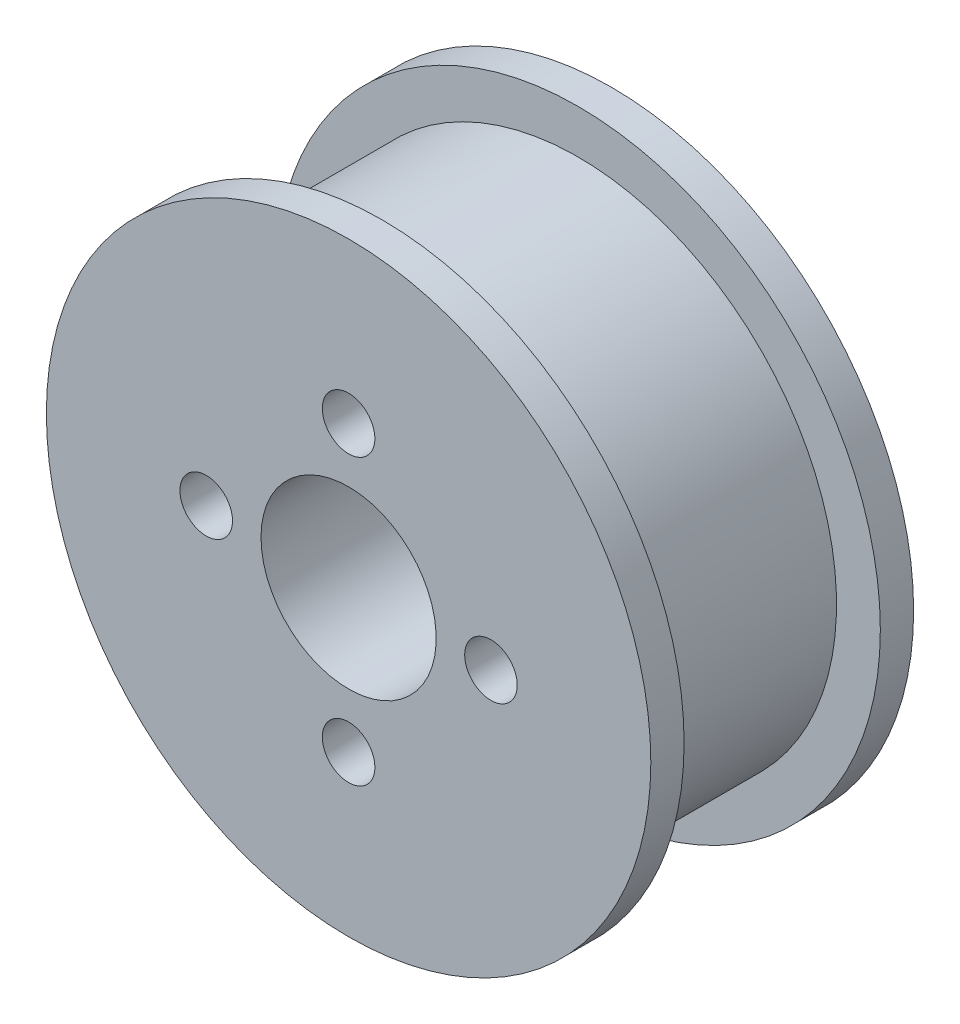
ISO-10303-21;
HEADER;
FILE_DESCRIPTION(('STEP AP214'),'2;1');
FILE_NAME('part.step','',(''),(''),'','','');
FILE_SCHEMA(('AUTOMOTIVE_DESIGN { 1 0 10303 214 1 1 1 1 }'));
ENDSEC;
DATA;
#1=APPLICATION_CONTEXT('core data for automotive mechanical design processes');
#2=APPLICATION_PROTOCOL_DEFINITION('international standard','automotive_design',2000,#1);
#3=PRODUCT_CONTEXT('',#1,'mechanical');
#4=PRODUCT('Part','Part','',(#3));
#5=PRODUCT_RELATED_PRODUCT_CATEGORY('part','',(#4));
#6=PRODUCT_DEFINITION_FORMATION('','',#4);
#7=PRODUCT_DEFINITION_CONTEXT('part definition',#1,'design');
#8=PRODUCT_DEFINITION('design','',#6,#7);
#9=PRODUCT_DEFINITION_SHAPE('','',#8);
#10=(LENGTH_UNIT() NAMED_UNIT(*) SI_UNIT(.MILLI.,.METRE.));
#11=(NAMED_UNIT(*) PLANE_ANGLE_UNIT() SI_UNIT($,.RADIAN.));
#12=(NAMED_UNIT(*) SI_UNIT($,.STERADIAN.) SOLID_ANGLE_UNIT());
#13=UNCERTAINTY_MEASURE_WITH_UNIT(LENGTH_MEASURE(1.E-05),#10,'distance_accuracy_value','');
#14=(GEOMETRIC_REPRESENTATION_CONTEXT(3) GLOBAL_UNCERTAINTY_ASSIGNED_CONTEXT((#13)) GLOBAL_UNIT_ASSIGNED_CONTEXT((#10,
#11,#12)) REPRESENTATION_CONTEXT('',''));
#15=CARTESIAN_POINT('',(0.,0.,0.));
#16=DIRECTION('',(0.,0.,1.));
#17=DIRECTION('',(1.,0.,0.));
#18=AXIS2_PLACEMENT_3D('',#15,#16,#17);
#19=CARTESIAN_POINT('',(0.,0.,1.9));
#20=DIRECTION('',(0.,0.,-1.));
#21=DIRECTION('',(-1.,0.,0.));
#22=AXIS2_PLACEMENT_3D('',#19,#20,#21);
#23=CYLINDRICAL_SURFACE('',#22,17.25);
#24=CARTESIAN_POINT('',(0.,0.,1.9));
#25=DIRECTION('',(0.,0.,1.));
#26=DIRECTION('',(1.,0.,0.));
#27=AXIS2_PLACEMENT_3D('',#24,#25,#26);
#28=CIRCLE('',#27,17.25);
#29=CARTESIAN_POINT('',(-17.25,0.,1.9));
#30=VERTEX_POINT('',#29);
#31=EDGE_CURVE('E44',#30,#30,#28,.T.);
#32=CARTESIAN_POINT('',(0.,0.,0.));
#33=DIRECTION('',(0.,0.,1.));
#34=DIRECTION('',(1.,0.,0.));
#35=AXIS2_PLACEMENT_3D('',#32,#33,#34);
#36=CIRCLE('',#35,17.25);
#37=CARTESIAN_POINT('',(-17.25,0.,0.));
#38=VERTEX_POINT('',#37);
#39=EDGE_CURVE('E40',#38,#38,#36,.T.);
#40=CARTESIAN_POINT('',(-17.25,0.,1.9));
#41=CARTESIAN_POINT('',(-17.25,0.,1.88020833333333));
#42=CARTESIAN_POINT('',(-17.25,0.,1.86041666666667));
#43=CARTESIAN_POINT('',(-17.25,0.,1.82083333333333));
#44=CARTESIAN_POINT('',(-17.25,0.,1.80104166666667));
#45=CARTESIAN_POINT('',(-17.25,0.,1.76145833333333));
#46=CARTESIAN_POINT('',(-17.25,0.,1.74166666666667));
#47=CARTESIAN_POINT('',(-17.25,0.,1.70208333333333));
#48=CARTESIAN_POINT('',(-17.25,0.,1.68229166666667));
#49=CARTESIAN_POINT('',(-17.25,0.,1.64270833333333));
#50=CARTESIAN_POINT('',(-17.25,0.,1.62291666666667));
#51=CARTESIAN_POINT('',(-17.25,0.,1.58333333333333));
#52=CARTESIAN_POINT('',(-17.25,0.,1.56354166666667));
#53=CARTESIAN_POINT('',(-17.25,0.,1.52395833333333));
#54=CARTESIAN_POINT('',(-17.25,0.,1.50416666666667));
#55=CARTESIAN_POINT('',(-17.25,0.,1.46458333333333));
#56=CARTESIAN_POINT('',(-17.25,0.,1.44479166666667));
#57=CARTESIAN_POINT('',(-17.25,0.,1.40520833333333));
#58=CARTESIAN_POINT('',(-17.25,0.,1.38541666666667));
#59=CARTESIAN_POINT('',(-17.25,0.,1.34583333333333));
#60=CARTESIAN_POINT('',(-17.25,0.,1.32604166666667));
#61=CARTESIAN_POINT('',(-17.25,0.,1.28645833333333));
#62=CARTESIAN_POINT('',(-17.25,0.,1.26666666666667));
#63=CARTESIAN_POINT('',(-17.25,0.,1.22708333333333));
#64=CARTESIAN_POINT('',(-17.25,0.,1.20729166666667));
#65=CARTESIAN_POINT('',(-17.25,0.,1.16770833333333));
#66=CARTESIAN_POINT('',(-17.25,0.,1.14791666666667));
#67=CARTESIAN_POINT('',(-17.25,0.,1.10833333333333));
#68=CARTESIAN_POINT('',(-17.25,0.,1.08854166666667));
#69=CARTESIAN_POINT('',(-17.25,0.,1.04895833333333));
#70=CARTESIAN_POINT('',(-17.25,0.,1.02916666666667));
#71=CARTESIAN_POINT('',(-17.25,0.,0.989583333333333));
#72=CARTESIAN_POINT('',(-17.25,0.,0.969791666666666));
#73=CARTESIAN_POINT('',(-17.25,0.,0.930208333333333));
#74=CARTESIAN_POINT('',(-17.25,0.,0.910416666666667));
#75=CARTESIAN_POINT('',(-17.25,0.,0.870833333333333));
#76=CARTESIAN_POINT('',(-17.25,0.,0.851041666666667));
#77=CARTESIAN_POINT('',(-17.25,0.,0.811458333333333));
#78=CARTESIAN_POINT('',(-17.25,0.,0.791666666666667));
#79=CARTESIAN_POINT('',(-17.25,0.,0.752083333333333));
#80=CARTESIAN_POINT('',(-17.25,0.,0.732291666666667));
#81=CARTESIAN_POINT('',(-17.25,0.,0.692708333333333));
#82=CARTESIAN_POINT('',(-17.25,0.,0.672916666666667));
#83=CARTESIAN_POINT('',(-17.25,0.,0.633333333333333));
#84=CARTESIAN_POINT('',(-17.25,0.,0.613541666666667));
#85=CARTESIAN_POINT('',(-17.25,0.,0.573958333333333));
#86=CARTESIAN_POINT('',(-17.25,0.,0.554166666666667));
#87=CARTESIAN_POINT('',(-17.25,0.,0.514583333333334));
#88=CARTESIAN_POINT('',(-17.25,0.,0.494791666666667));
#89=CARTESIAN_POINT('',(-17.25,0.,0.455208333333333));
#90=CARTESIAN_POINT('',(-17.25,0.,0.435416666666667));
#91=CARTESIAN_POINT('',(-17.25,0.,0.395833333333333));
#92=CARTESIAN_POINT('',(-17.25,0.,0.376041666666667));
#93=CARTESIAN_POINT('',(-17.25,0.,0.336458333333333));
#94=CARTESIAN_POINT('',(-17.25,0.,0.316666666666667));
#95=CARTESIAN_POINT('',(-17.25,0.,0.277083333333333));
#96=CARTESIAN_POINT('',(-17.25,0.,0.257291666666667));
#97=CARTESIAN_POINT('',(-17.25,0.,0.217708333333333));
#98=CARTESIAN_POINT('',(-17.25,0.,0.197916666666667));
#99=CARTESIAN_POINT('',(-17.25,0.,0.158333333333333));
#100=CARTESIAN_POINT('',(-17.25,0.,0.138541666666667));
#101=CARTESIAN_POINT('',(-17.25,0.,0.0989583333333333));
#102=CARTESIAN_POINT('',(-17.25,0.,0.0791666666666666));
#103=CARTESIAN_POINT('',(-17.25,0.,0.0395833333333333));
#104=CARTESIAN_POINT('',(-17.25,0.,0.0197916666666666));
#105=CARTESIAN_POINT('',(-17.25,0.,0.));
#106=B_SPLINE_CURVE_WITH_KNOTS('',3,(#40,#41,#42,#43,#44,#45,#46,#47,#48,#49,#50,#51,#52,#53,
#54,#55,#56,#57,#58,#59,#60,#61,#62,#63,#64,#65,#66,#67,#68,#69,#70,#71,#72,#73,#74,#75,#76,#77,
#78,#79,#80,#81,#82,#83,#84,#85,#86,#87,#88,#89,#90,#91,#92,#93,#94,#95,#96,#97,#98,#99,#100,
#101,#102,#103,#104,#105),.UNSPECIFIED.,.F.,.F.,(4,2,2,2,2,2,2,2,2,2,2,2,2,2,2,2,2,2,2,2,2,2,2,
2,2,2,2,2,2,2,2,2,4),(0.,0.0593750000000002,0.11875,0.178125,0.2375,0.296875,0.35625,0.415625,
0.475,0.534375,0.59375,0.653125,0.7125,0.771875,0.83125,0.890625,0.95,1.009375,1.06875,1.128125,
1.1875,1.246875,1.30625,1.365625,1.425,1.484375,1.54375,1.603125,1.6625,1.721875,1.78125,
1.840625,1.9),.UNSPECIFIED.);
#107=EDGE_CURVE('BSEAM37',#30,#38,#106,.T.);
#108=ORIENTED_EDGE('',*,*,#31,.F.);
#109=ORIENTED_EDGE('',*,*,#39,.T.);
#110=ORIENTED_EDGE('',*,*,#107,.T.);
#111=ORIENTED_EDGE('',*,*,#107,.F.);
#112=EDGE_LOOP('',(#108,#110,#109,#111));
#113=FACE_BOUND('',#112,.T.);
#114=ADVANCED_FACE('F37',(#113),#23,.T.);
#115=CARTESIAN_POINT('',(0.,0.,1.9));
#116=DIRECTION('',(0.,0.,1.));
#117=DIRECTION('',(1.,0.,0.));
#118=AXIS2_PLACEMENT_3D('',#115,#116,#117);
#119=PLANE('',#118);
#120=CARTESIAN_POINT('',(0.,8.125,1.9));
#121=DIRECTION('',(0.,0.,-1.));
#122=DIRECTION('',(-1.,0.,0.));
#123=AXIS2_PLACEMENT_3D('',#120,#121,#122);
#124=CIRCLE('',#123,1.5);
#125=CARTESIAN_POINT('',(-1.5,8.125,1.9));
#126=VERTEX_POINT('',#125);
#127=EDGE_CURVE('E63',#126,#126,#124,.T.);
#128=ORIENTED_EDGE('',*,*,#127,.T.);
#129=EDGE_LOOP('',(#128));
#130=FACE_BOUND('',#129,.T.);
#131=CARTESIAN_POINT('',(-8.125,0.,1.9));
#132=DIRECTION('',(0.,0.,-1.));
#133=DIRECTION('',(-1.,0.,0.));
#134=AXIS2_PLACEMENT_3D('',#131,#132,#133);
#135=CIRCLE('',#134,1.5);
#136=CARTESIAN_POINT('',(-9.625,0.,1.9));
#137=VERTEX_POINT('',#136);
#138=EDGE_CURVE('E78',#137,#137,#135,.T.);
#139=ORIENTED_EDGE('',*,*,#138,.T.);
#140=EDGE_LOOP('',(#139));
#141=FACE_BOUND('',#140,.T.);
#142=CARTESIAN_POINT('',(0.,-8.125,1.9));
#143=DIRECTION('',(0.,0.,-1.));
#144=DIRECTION('',(-1.,0.,0.));
#145=AXIS2_PLACEMENT_3D('',#142,#143,#144);
#146=CIRCLE('',#145,1.5);
#147=CARTESIAN_POINT('',(-1.5,-8.125,1.9));
#148=VERTEX_POINT('',#147);
#149=EDGE_CURVE('E72',#148,#148,#146,.T.);
#150=ORIENTED_EDGE('',*,*,#149,.T.);
#151=EDGE_LOOP('',(#150));
#152=FACE_BOUND('',#151,.T.);
#153=CARTESIAN_POINT('',(8.125,0.,1.9));
#154=DIRECTION('',(0.,0.,-1.));
#155=DIRECTION('',(-1.,0.,0.));
#156=AXIS2_PLACEMENT_3D('',#153,#154,#155);
#157=CIRCLE('',#156,1.5);
#158=CARTESIAN_POINT('',(6.625,0.,1.9));
#159=VERTEX_POINT('',#158);
#160=EDGE_CURVE('E66',#159,#159,#157,.T.);
#161=ORIENTED_EDGE('',*,*,#160,.T.);
#162=EDGE_LOOP('',(#161));
#163=FACE_BOUND('',#162,.T.);
#164=CARTESIAN_POINT('',(0.,0.,1.9));
#165=DIRECTION('',(0.,0.,-1.));
#166=DIRECTION('',(-1.,0.,0.));
#167=AXIS2_PLACEMENT_3D('',#164,#165,#166);
#168=CIRCLE('',#167,5.);
#169=CARTESIAN_POINT('',(-5.,0.,1.9));
#170=VERTEX_POINT('',#169);
#171=EDGE_CURVE('E57',#170,#170,#168,.T.);
#172=ORIENTED_EDGE('',*,*,#171,.T.);
#173=EDGE_LOOP('',(#172));
#174=FACE_BOUND('',#173,.T.);
#175=ORIENTED_EDGE('',*,*,#31,.T.);
#176=EDGE_LOOP('',(#175));
#177=FACE_BOUND('',#176,.T.);
#178=ADVANCED_FACE('F90',(#130,#141,#152,#163,#174,#177),#119,.T.);
#179=CARTESIAN_POINT('',(0.,0.,0.));
#180=DIRECTION('',(0.,0.,1.));
#181=DIRECTION('',(1.,0.,0.));
#182=AXIS2_PLACEMENT_3D('',#179,#180,#181);
#183=PLANE('',#182);
#184=CARTESIAN_POINT('',(0.,0.,0.));
#185=DIRECTION('',(0.,0.,-1.));
#186=DIRECTION('',(-1.,0.,0.));
#187=AXIS2_PLACEMENT_3D('',#184,#185,#186);
#188=CIRCLE('',#187,14.75);
#189=CARTESIAN_POINT('',(-14.75,0.,0.));
#190=VERTEX_POINT('',#189);
#191=EDGE_CURVE('E10',#190,#190,#188,.T.);
#192=ORIENTED_EDGE('',*,*,#191,.F.);
#193=EDGE_LOOP('',(#192));
#194=FACE_BOUND('',#193,.T.);
#195=ORIENTED_EDGE('',*,*,#39,.F.);
#196=EDGE_LOOP('',(#195));
#197=FACE_BOUND('',#196,.T.);
#198=ADVANCED_FACE('F138',(#194,#197),#183,.F.);
#199=CARTESIAN_POINT('',(0.,0.,-11.2));
#200=DIRECTION('',(0.,0.,1.));
#201=DIRECTION('',(1.,0.,0.));
#202=AXIS2_PLACEMENT_3D('',#199,#200,#201);
#203=CYLINDRICAL_SURFACE('',#202,14.75);
#204=CARTESIAN_POINT('',(0.,0.,-11.2));
#205=DIRECTION('',(0.,0.,-1.));
#206=DIRECTION('',(-1.,0.,0.));
#207=AXIS2_PLACEMENT_3D('',#204,#205,#206);
#208=CIRCLE('',#207,14.75);
#209=CARTESIAN_POINT('',(-14.75,0.,-11.2));
#210=VERTEX_POINT('',#209);
#211=EDGE_CURVE('E50',#210,#210,#208,.T.);
#212=ORIENTED_EDGE('',*,*,#211,.F.);
#213=EDGE_LOOP('',(#212));
#214=FACE_BOUND('',#213,.T.);
#215=ORIENTED_EDGE('',*,*,#191,.T.);
#216=EDGE_LOOP('',(#215));
#217=FACE_BOUND('',#216,.T.);
#218=ADVANCED_FACE('F118',(#214,#217),#203,.T.);
#219=CARTESIAN_POINT('',(0.,0.,-13.1));
#220=DIRECTION('',(0.,0.,1.));
#221=DIRECTION('',(1.,0.,0.));
#222=AXIS2_PLACEMENT_3D('',#219,#220,#221);
#223=CYLINDRICAL_SURFACE('',#222,17.25);
#224=CARTESIAN_POINT('',(0.,0.,-13.1));
#225=DIRECTION('',(0.,0.,-1.));
#226=DIRECTION('',(-1.,0.,0.));
#227=AXIS2_PLACEMENT_3D('',#224,#225,#226);
#228=CIRCLE('',#227,17.25);
#229=CARTESIAN_POINT('',(17.25,0.,-13.1));
#230=VERTEX_POINT('',#229);
#231=EDGE_CURVE('E53',#230,#230,#228,.T.);
#232=CARTESIAN_POINT('',(0.,0.,-11.2));
#233=DIRECTION('',(0.,0.,-1.));
#234=DIRECTION('',(-1.,0.,0.));
#235=AXIS2_PLACEMENT_3D('',#232,#233,#234);
#236=CIRCLE('',#235,17.25);
#237=CARTESIAN_POINT('',(17.25,0.,-11.2));
#238=VERTEX_POINT('',#237);
#239=EDGE_CURVE('E54',#238,#238,#236,.T.);
#240=CARTESIAN_POINT('',(17.25,0.,-13.1));
#241=CARTESIAN_POINT('',(17.25,0.,-13.0802083333333));
#242=CARTESIAN_POINT('',(17.25,0.,-13.0604166666667));
#243=CARTESIAN_POINT('',(17.25,0.,-13.0208333333333));
#244=CARTESIAN_POINT('',(17.25,0.,-13.0010416666667));
#245=CARTESIAN_POINT('',(17.25,0.,-12.9614583333333));
#246=CARTESIAN_POINT('',(17.25,0.,-12.9416666666667));
#247=CARTESIAN_POINT('',(17.25,0.,-12.9020833333333));
#248=CARTESIAN_POINT('',(17.25,0.,-12.8822916666667));
#249=CARTESIAN_POINT('',(17.25,0.,-12.8427083333333));
#250=CARTESIAN_POINT('',(17.25,0.,-12.8229166666667));
#251=CARTESIAN_POINT('',(17.25,0.,-12.7833333333333));
#252=CARTESIAN_POINT('',(17.25,0.,-12.7635416666667));
#253=CARTESIAN_POINT('',(17.25,0.,-12.7239583333333));
#254=CARTESIAN_POINT('',(17.25,0.,-12.7041666666667));
#255=CARTESIAN_POINT('',(17.25,0.,-12.6645833333333));
#256=CARTESIAN_POINT('',(17.25,0.,-12.6447916666667));
#257=CARTESIAN_POINT('',(17.25,0.,-12.6052083333333));
#258=CARTESIAN_POINT('',(17.25,0.,-12.5854166666667));
#259=CARTESIAN_POINT('',(17.25,0.,-12.5458333333333));
#260=CARTESIAN_POINT('',(17.25,0.,-12.5260416666667));
#261=CARTESIAN_POINT('',(17.25,0.,-12.4864583333333));
#262=CARTESIAN_POINT('',(17.25,0.,-12.4666666666667));
#263=CARTESIAN_POINT('',(17.25,0.,-12.4270833333333));
#264=CARTESIAN_POINT('',(17.25,0.,-12.4072916666667));
#265=CARTESIAN_POINT('',(17.25,0.,-12.3677083333333));
#266=CARTESIAN_POINT('',(17.25,0.,-12.3479166666667));
#267=CARTESIAN_POINT('',(17.25,0.,-12.3083333333333));
#268=CARTESIAN_POINT('',(17.25,0.,-12.2885416666667));
#269=CARTESIAN_POINT('',(17.25,0.,-12.2489583333333));
#270=CARTESIAN_POINT('',(17.25,0.,-12.2291666666667));
#271=CARTESIAN_POINT('',(17.25,0.,-12.1895833333333));
#272=CARTESIAN_POINT('',(17.25,0.,-12.1697916666667));
#273=CARTESIAN_POINT('',(17.25,0.,-12.1302083333333));
#274=CARTESIAN_POINT('',(17.25,0.,-12.1104166666667));
#275=CARTESIAN_POINT('',(17.25,0.,-12.0708333333333));
#276=CARTESIAN_POINT('',(17.25,0.,-12.0510416666667));
#277=CARTESIAN_POINT('',(17.25,0.,-12.0114583333333));
#278=CARTESIAN_POINT('',(17.25,0.,-11.9916666666667));
#279=CARTESIAN_POINT('',(17.25,0.,-11.9520833333333));
#280=CARTESIAN_POINT('',(17.25,0.,-11.9322916666667));
#281=CARTESIAN_POINT('',(17.25,0.,-11.8927083333333));
#282=CARTESIAN_POINT('',(17.25,0.,-11.8729166666667));
#283=CARTESIAN_POINT('',(17.25,0.,-11.8333333333333));
#284=CARTESIAN_POINT('',(17.25,0.,-11.8135416666667));
#285=CARTESIAN_POINT('',(17.25,0.,-11.7739583333333));
#286=CARTESIAN_POINT('',(17.25,0.,-11.7541666666667));
#287=CARTESIAN_POINT('',(17.25,0.,-11.7145833333333));
#288=CARTESIAN_POINT('',(17.25,0.,-11.6947916666667));
#289=CARTESIAN_POINT('',(17.25,0.,-11.6552083333333));
#290=CARTESIAN_POINT('',(17.25,0.,-11.6354166666667));
#291=CARTESIAN_POINT('',(17.25,0.,-11.5958333333333));
#292=CARTESIAN_POINT('',(17.25,0.,-11.5760416666667));
#293=CARTESIAN_POINT('',(17.25,0.,-11.5364583333333));
#294=CARTESIAN_POINT('',(17.25,0.,-11.5166666666667));
#295=CARTESIAN_POINT('',(17.25,0.,-11.4770833333333));
#296=CARTESIAN_POINT('',(17.25,0.,-11.4572916666667));
#297=CARTESIAN_POINT('',(17.25,0.,-11.4177083333333));
#298=CARTESIAN_POINT('',(17.25,0.,-11.3979166666667));
#299=CARTESIAN_POINT('',(17.25,0.,-11.3583333333333));
#300=CARTESIAN_POINT('',(17.25,0.,-11.3385416666667));
#301=CARTESIAN_POINT('',(17.25,0.,-11.2989583333333));
#302=CARTESIAN_POINT('',(17.25,0.,-11.2791666666667));
#303=CARTESIAN_POINT('',(17.25,0.,-11.2395833333333));
#304=CARTESIAN_POINT('',(17.25,0.,-11.2197916666667));
#305=CARTESIAN_POINT('',(17.25,0.,-11.2));
#306=B_SPLINE_CURVE_WITH_KNOTS('',3,(#240,#241,#242,#243,#244,#245,#246,#247,#248,#249,#250,
#251,#252,#253,#254,#255,#256,#257,#258,#259,#260,#261,#262,#263,#264,#265,#266,#267,#268,#269,
#270,#271,#272,#273,#274,#275,#276,#277,#278,#279,#280,#281,#282,#283,#284,#285,#286,#287,#288,
#289,#290,#291,#292,#293,#294,#295,#296,#297,#298,#299,#300,#301,#302,#303,#304,#305),
.UNSPECIFIED.,.F.,.F.,(4,2,2,2,2,2,2,2,2,2,2,2,2,2,2,2,2,2,2,2,2,2,2,2,2,2,2,2,2,2,2,2,4),(0.,
0.0593749999999987,0.118749999999999,0.178124999999999,0.2375,0.296874999999999,
0.356249999999999,0.415624999999999,0.475,0.534374999999998,0.593749999999999,0.653124999999999,
0.7125,0.771875,0.831249999999999,0.890624999999999,0.95,1.009375,1.06875,1.128125,1.1875,
1.246875,1.30625,1.365625,1.425,1.484375,1.54375,1.603125,1.6625,1.721875,1.78125,1.840625,1.9),.UNSPECIFIED.);
#307=EDGE_CURVE('BSEAM104',#230,#238,#306,.T.);
#308=ORIENTED_EDGE('',*,*,#231,.F.);
#309=ORIENTED_EDGE('',*,*,#239,.T.);
#310=ORIENTED_EDGE('',*,*,#307,.T.);
#311=ORIENTED_EDGE('',*,*,#307,.F.);
#312=EDGE_LOOP('',(#308,#310,#309,#311));
#313=FACE_BOUND('',#312,.T.);
#314=ADVANCED_FACE('F104',(#313),#223,.T.);
#315=CARTESIAN_POINT('',(0.,0.,-13.1));
#316=DIRECTION('',(0.,0.,-1.));
#317=DIRECTION('',(-1.,0.,0.));
#318=AXIS2_PLACEMENT_3D('',#315,#316,#317);
#319=PLANE('',#318);
#320=CARTESIAN_POINT('',(0.,8.125,-13.1));
#321=DIRECTION('',(0.,0.,-1.));
#322=DIRECTION('',(-1.,0.,0.));
#323=AXIS2_PLACEMENT_3D('',#320,#321,#322);
#324=CIRCLE('',#323,1.5);
#325=CARTESIAN_POINT('',(-1.5,8.125,-13.1));
#326=VERTEX_POINT('',#325);
#327=EDGE_CURVE('E84',#326,#326,#324,.T.);
#328=ORIENTED_EDGE('',*,*,#327,.F.);
#329=EDGE_LOOP('',(#328));
#330=FACE_BOUND('',#329,.T.);
#331=CARTESIAN_POINT('',(-8.125,0.,-13.1));
#332=DIRECTION('',(0.,0.,-1.));
#333=DIRECTION('',(-1.,0.,0.));
#334=AXIS2_PLACEMENT_3D('',#331,#332,#333);
#335=CIRCLE('',#334,1.5);
#336=CARTESIAN_POINT('',(-9.625,0.,-13.1));
#337=VERTEX_POINT('',#336);
#338=EDGE_CURVE('E81',#337,#337,#335,.T.);
#339=ORIENTED_EDGE('',*,*,#338,.F.);
#340=EDGE_LOOP('',(#339));
#341=FACE_BOUND('',#340,.T.);
#342=CARTESIAN_POINT('',(0.,-8.125,-13.1));
#343=DIRECTION('',(0.,0.,-1.));
#344=DIRECTION('',(-1.,0.,0.));
#345=AXIS2_PLACEMENT_3D('',#342,#343,#344);
#346=CIRCLE('',#345,1.5);
#347=CARTESIAN_POINT('',(-1.5,-8.125,-13.1));
#348=VERTEX_POINT('',#347);
#349=EDGE_CURVE('E75',#348,#348,#346,.T.);
#350=ORIENTED_EDGE('',*,*,#349,.F.);
#351=EDGE_LOOP('',(#350));
#352=FACE_BOUND('',#351,.T.);
#353=CARTESIAN_POINT('',(8.125,0.,-13.1));
#354=DIRECTION('',(0.,0.,-1.));
#355=DIRECTION('',(-1.,0.,0.));
#356=AXIS2_PLACEMENT_3D('',#353,#354,#355);
#357=CIRCLE('',#356,1.5);
#358=CARTESIAN_POINT('',(6.625,0.,-13.1));
#359=VERTEX_POINT('',#358);
#360=EDGE_CURVE('E69',#359,#359,#357,.T.);
#361=ORIENTED_EDGE('',*,*,#360,.F.);
#362=EDGE_LOOP('',(#361));
#363=FACE_BOUND('',#362,.T.);
#364=CARTESIAN_POINT('',(0.,0.,-13.1));
#365=DIRECTION('',(0.,0.,-1.));
#366=DIRECTION('',(-1.,0.,0.));
#367=AXIS2_PLACEMENT_3D('',#364,#365,#366);
#368=CIRCLE('',#367,5.);
#369=CARTESIAN_POINT('',(-5.,0.,-13.1));
#370=VERTEX_POINT('',#369);
#371=EDGE_CURVE('E60',#370,#370,#368,.T.);
#372=ORIENTED_EDGE('',*,*,#371,.F.);
#373=EDGE_LOOP('',(#372));
#374=FACE_BOUND('',#373,.T.);
#375=ORIENTED_EDGE('',*,*,#231,.T.);
#376=EDGE_LOOP('',(#375));
#377=FACE_BOUND('',#376,.T.);
#378=ADVANCED_FACE('F100',(#330,#341,#352,#363,#374,#377),#319,.T.);
#379=CARTESIAN_POINT('',(0.,0.,-11.2));
#380=DIRECTION('',(0.,0.,-1.));
#381=DIRECTION('',(-1.,0.,0.));
#382=AXIS2_PLACEMENT_3D('',#379,#380,#381);
#383=PLANE('',#382);
#384=ORIENTED_EDGE('',*,*,#211,.T.);
#385=EDGE_LOOP('',(#384));
#386=FACE_BOUND('',#385,.T.);
#387=ORIENTED_EDGE('',*,*,#239,.F.);
#388=EDGE_LOOP('',(#387));
#389=FACE_BOUND('',#388,.T.);
#390=ADVANCED_FACE('F103',(#386,#389),#383,.F.);
#391=CARTESIAN_POINT('',(0.,0.,1.9));
#392=DIRECTION('',(0.,0.,-1.));
#393=DIRECTION('',(-1.,0.,0.));
#394=AXIS2_PLACEMENT_3D('',#391,#392,#393);
#395=CYLINDRICAL_SURFACE('',#394,5.);
#396=CARTESIAN_POINT('',(-5.,0.,1.9));
#397=CARTESIAN_POINT('',(-5.,0.,1.74375));
#398=CARTESIAN_POINT('',(-5.,0.,1.5875));
#399=CARTESIAN_POINT('',(-5.,0.,1.275));
#400=CARTESIAN_POINT('',(-5.,0.,1.11875));
#401=CARTESIAN_POINT('',(-5.,0.,0.806250000000001));
#402=CARTESIAN_POINT('',(-5.,0.,0.65));
#403=CARTESIAN_POINT('',(-5.,0.,0.3375));
#404=CARTESIAN_POINT('',(-5.,0.,0.18125));
#405=CARTESIAN_POINT('',(-5.,0.,-0.131249999999999));
#406=CARTESIAN_POINT('',(-5.,0.,-0.287499999999999));
#407=CARTESIAN_POINT('',(-5.,0.,-0.599999999999999));
#408=CARTESIAN_POINT('',(-5.,0.,-0.75625));
#409=CARTESIAN_POINT('',(-5.,0.,-1.06875));
#410=CARTESIAN_POINT('',(-5.,0.,-1.225));
#411=CARTESIAN_POINT('',(-5.,0.,-1.5375));
#412=CARTESIAN_POINT('',(-5.,0.,-1.69375));
#413=CARTESIAN_POINT('',(-5.,0.,-2.00625));
#414=CARTESIAN_POINT('',(-5.,0.,-2.1625));
#415=CARTESIAN_POINT('',(-5.,0.,-2.475));
#416=CARTESIAN_POINT('',(-5.,0.,-2.63125));
#417=CARTESIAN_POINT('',(-5.,0.,-2.94375));
#418=CARTESIAN_POINT('',(-5.,0.,-3.1));
#419=CARTESIAN_POINT('',(-5.,0.,-3.4125));
#420=CARTESIAN_POINT('',(-5.,0.,-3.56875));
#421=CARTESIAN_POINT('',(-5.,0.,-3.88125));
#422=CARTESIAN_POINT('',(-5.,0.,-4.0375));
#423=CARTESIAN_POINT('',(-5.,0.,-4.35));
#424=CARTESIAN_POINT('',(-5.,0.,-4.50625));
#425=CARTESIAN_POINT('',(-5.,0.,-4.81875));
#426=CARTESIAN_POINT('',(-5.,0.,-4.975));
#427=CARTESIAN_POINT('',(-5.,0.,-5.2875));
#428=CARTESIAN_POINT('',(-5.,0.,-5.44375));
#429=CARTESIAN_POINT('',(-5.,0.,-5.75625));
#430=CARTESIAN_POINT('',(-5.,0.,-5.9125));
#431=CARTESIAN_POINT('',(-5.,0.,-6.225));
#432=CARTESIAN_POINT('',(-5.,0.,-6.38125));
#433=CARTESIAN_POINT('',(-5.,0.,-6.69375));
#434=CARTESIAN_POINT('',(-5.,0.,-6.85));
#435=CARTESIAN_POINT('',(-5.,0.,-7.1625));
#436=CARTESIAN_POINT('',(-5.,0.,-7.31875));
#437=CARTESIAN_POINT('',(-5.,0.,-7.63125));
#438=CARTESIAN_POINT('',(-5.,0.,-7.7875));
#439=CARTESIAN_POINT('',(-5.,0.,-8.1));
#440=CARTESIAN_POINT('',(-5.,0.,-8.25625));
#441=CARTESIAN_POINT('',(-5.,0.,-8.56875));
#442=CARTESIAN_POINT('',(-5.,0.,-8.725));
#443=CARTESIAN_POINT('',(-5.,0.,-9.0375));
#444=CARTESIAN_POINT('',(-5.,0.,-9.19375));
#445=CARTESIAN_POINT('',(-5.,0.,-9.50625));
#446=CARTESIAN_POINT('',(-5.,0.,-9.6625));
#447=CARTESIAN_POINT('',(-5.,0.,-9.975));
#448=CARTESIAN_POINT('',(-5.,0.,-10.13125));
#449=CARTESIAN_POINT('',(-5.,0.,-10.44375));
#450=CARTESIAN_POINT('',(-5.,0.,-10.6));
#451=CARTESIAN_POINT('',(-5.,0.,-10.9125));
#452=CARTESIAN_POINT('',(-5.,0.,-11.06875));
#453=CARTESIAN_POINT('',(-5.,0.,-11.38125));
#454=CARTESIAN_POINT('',(-5.,0.,-11.5375));
#455=CARTESIAN_POINT('',(-5.,0.,-11.85));
#456=CARTESIAN_POINT('',(-5.,0.,-12.00625));
#457=CARTESIAN_POINT('',(-5.,0.,-12.31875));
#458=CARTESIAN_POINT('',(-5.,0.,-12.475));
#459=CARTESIAN_POINT('',(-5.,0.,-12.7875));
#460=CARTESIAN_POINT('',(-5.,0.,-12.94375));
#461=CARTESIAN_POINT('',(-5.,0.,-13.1));
#462=B_SPLINE_CURVE_WITH_KNOTS('',3,(#396,#397,#398,#399,#400,#401,#402,#403,#404,#405,#406,
#407,#408,#409,#410,#411,#412,#413,#414,#415,#416,#417,#418,#419,#420,#421,#422,#423,#424,#425,
#426,#427,#428,#429,#430,#431,#432,#433,#434,#435,#436,#437,#438,#439,#440,#441,#442,#443,#444,
#445,#446,#447,#448,#449,#450,#451,#452,#453,#454,#455,#456,#457,#458,#459,#460,#461),
.UNSPECIFIED.,.F.,.F.,(4,2,2,2,2,2,2,2,2,2,2,2,2,2,2,2,2,2,2,2,2,2,2,2,2,2,2,2,2,2,2,2,4),(0.,
0.46875,0.9375,1.40625,1.875,2.34375,2.8125,3.28125,3.75,4.21875,4.6875,5.15625,5.625,6.09375,
6.5625,7.03125,7.5,7.96875,8.4375,8.90625,9.375,9.84375,10.3125,10.78125,11.25,11.71875,12.1875,
12.65625,13.125,13.59375,14.0625,14.53125,15.),.UNSPECIFIED.);
#463=EDGE_CURVE('BSEAM123',#170,#370,#462,.T.);
#464=ORIENTED_EDGE('',*,*,#171,.F.);
#465=ORIENTED_EDGE('',*,*,#371,.T.);
#466=ORIENTED_EDGE('',*,*,#463,.T.);
#467=ORIENTED_EDGE('',*,*,#463,.F.);
#468=EDGE_LOOP('',(#464,#466,#465,#467));
#469=FACE_BOUND('',#468,.T.);
#470=ADVANCED_FACE('F123',(#469),#395,.F.);
#471=CARTESIAN_POINT('',(8.125,0.,1.9));
#472=DIRECTION('',(0.,0.,-1.));
#473=DIRECTION('',(-1.,0.,0.));
#474=AXIS2_PLACEMENT_3D('',#471,#472,#473);
#475=CYLINDRICAL_SURFACE('',#474,1.5);
#476=CARTESIAN_POINT('',(6.625,0.,1.9));
#477=CARTESIAN_POINT('',(6.625,0.,1.74375));
#478=CARTESIAN_POINT('',(6.625,0.,1.5875));
#479=CARTESIAN_POINT('',(6.625,0.,1.275));
#480=CARTESIAN_POINT('',(6.625,0.,1.11875));
#481=CARTESIAN_POINT('',(6.625,0.,0.806250000000001));
#482=CARTESIAN_POINT('',(6.625,0.,0.65));
#483=CARTESIAN_POINT('',(6.625,0.,0.3375));
#484=CARTESIAN_POINT('',(6.625,0.,0.18125));
#485=CARTESIAN_POINT('',(6.625,0.,-0.131249999999999));
#486=CARTESIAN_POINT('',(6.625,0.,-0.287499999999999));
#487=CARTESIAN_POINT('',(6.625,0.,-0.599999999999999));
#488=CARTESIAN_POINT('',(6.625,0.,-0.75625));
#489=CARTESIAN_POINT('',(6.625,0.,-1.06875));
#490=CARTESIAN_POINT('',(6.625,0.,-1.225));
#491=CARTESIAN_POINT('',(6.625,0.,-1.5375));
#492=CARTESIAN_POINT('',(6.625,0.,-1.69375));
#493=CARTESIAN_POINT('',(6.625,0.,-2.00625));
#494=CARTESIAN_POINT('',(6.625,0.,-2.1625));
#495=CARTESIAN_POINT('',(6.625,0.,-2.475));
#496=CARTESIAN_POINT('',(6.625,0.,-2.63125));
#497=CARTESIAN_POINT('',(6.625,0.,-2.94375));
#498=CARTESIAN_POINT('',(6.625,0.,-3.1));
#499=CARTESIAN_POINT('',(6.625,0.,-3.4125));
#500=CARTESIAN_POINT('',(6.625,0.,-3.56875));
#501=CARTESIAN_POINT('',(6.625,0.,-3.88125));
#502=CARTESIAN_POINT('',(6.625,0.,-4.0375));
#503=CARTESIAN_POINT('',(6.625,0.,-4.35));
#504=CARTESIAN_POINT('',(6.625,0.,-4.50625));
#505=CARTESIAN_POINT('',(6.625,0.,-4.81875));
#506=CARTESIAN_POINT('',(6.625,0.,-4.975));
#507=CARTESIAN_POINT('',(6.625,0.,-5.2875));
#508=CARTESIAN_POINT('',(6.625,0.,-5.44375));
#509=CARTESIAN_POINT('',(6.625,0.,-5.75625));
#510=CARTESIAN_POINT('',(6.625,0.,-5.9125));
#511=CARTESIAN_POINT('',(6.625,0.,-6.225));
#512=CARTESIAN_POINT('',(6.625,0.,-6.38125));
#513=CARTESIAN_POINT('',(6.625,0.,-6.69375));
#514=CARTESIAN_POINT('',(6.625,0.,-6.85));
#515=CARTESIAN_POINT('',(6.625,0.,-7.1625));
#516=CARTESIAN_POINT('',(6.625,0.,-7.31875));
#517=CARTESIAN_POINT('',(6.625,0.,-7.63125));
#518=CARTESIAN_POINT('',(6.625,0.,-7.7875));
#519=CARTESIAN_POINT('',(6.625,0.,-8.1));
#520=CARTESIAN_POINT('',(6.625,0.,-8.25625));
#521=CARTESIAN_POINT('',(6.625,0.,-8.56875));
#522=CARTESIAN_POINT('',(6.625,0.,-8.725));
#523=CARTESIAN_POINT('',(6.625,0.,-9.0375));
#524=CARTESIAN_POINT('',(6.625,0.,-9.19375));
#525=CARTESIAN_POINT('',(6.625,0.,-9.50625));
#526=CARTESIAN_POINT('',(6.625,0.,-9.6625));
#527=CARTESIAN_POINT('',(6.625,0.,-9.975));
#528=CARTESIAN_POINT('',(6.625,0.,-10.13125));
#529=CARTESIAN_POINT('',(6.625,0.,-10.44375));
#530=CARTESIAN_POINT('',(6.625,0.,-10.6));
#531=CARTESIAN_POINT('',(6.625,0.,-10.9125));
#532=CARTESIAN_POINT('',(6.625,0.,-11.06875));
#533=CARTESIAN_POINT('',(6.625,0.,-11.38125));
#534=CARTESIAN_POINT('',(6.625,0.,-11.5375));
#535=CARTESIAN_POINT('',(6.625,0.,-11.85));
#536=CARTESIAN_POINT('',(6.625,0.,-12.00625));
#537=CARTESIAN_POINT('',(6.625,0.,-12.31875));
#538=CARTESIAN_POINT('',(6.625,0.,-12.475));
#539=CARTESIAN_POINT('',(6.625,0.,-12.7875));
#540=CARTESIAN_POINT('',(6.625,0.,-12.94375));
#541=CARTESIAN_POINT('',(6.625,0.,-13.1));
#542=B_SPLINE_CURVE_WITH_KNOTS('',3,(#476,#477,#478,#479,#480,#481,#482,#483,#484,#485,#486,
#487,#488,#489,#490,#491,#492,#493,#494,#495,#496,#497,#498,#499,#500,#501,#502,#503,#504,#505,
#506,#507,#508,#509,#510,#511,#512,#513,#514,#515,#516,#517,#518,#519,#520,#521,#522,#523,#524,
#525,#526,#527,#528,#529,#530,#531,#532,#533,#534,#535,#536,#537,#538,#539,#540,#541),
.UNSPECIFIED.,.F.,.F.,(4,2,2,2,2,2,2,2,2,2,2,2,2,2,2,2,2,2,2,2,2,2,2,2,2,2,2,2,2,2,2,2,4),(0.,
0.46875,0.9375,1.40625,1.875,2.34375,2.8125,3.28125,3.75,4.21875,4.6875,5.15625,5.625,6.09375,
6.5625,7.03125,7.5,7.96875,8.4375,8.90625,9.375,9.84375,10.3125,10.78125,11.25,11.71875,12.1875,
12.65625,13.125,13.59375,14.0625,14.53125,15.),.UNSPECIFIED.);
#543=EDGE_CURVE('BSEAM129',#159,#359,#542,.T.);
#544=ORIENTED_EDGE('',*,*,#160,.F.);
#545=ORIENTED_EDGE('',*,*,#360,.T.);
#546=ORIENTED_EDGE('',*,*,#543,.T.);
#547=ORIENTED_EDGE('',*,*,#543,.F.);
#548=EDGE_LOOP('',(#544,#546,#545,#547));
#549=FACE_BOUND('',#548,.T.);
#550=ADVANCED_FACE('F129',(#549),#475,.F.);
#551=CARTESIAN_POINT('',(0.,-8.125,1.9));
#552=DIRECTION('',(0.,0.,-1.));
#553=DIRECTION('',(-1.,0.,0.));
#554=AXIS2_PLACEMENT_3D('',#551,#552,#553);
#555=CYLINDRICAL_SURFACE('',#554,1.5);
#556=CARTESIAN_POINT('',(-1.5,-8.125,1.9));
#557=CARTESIAN_POINT('',(-1.5,-8.125,1.74375));
#558=CARTESIAN_POINT('',(-1.5,-8.125,1.5875));
#559=CARTESIAN_POINT('',(-1.5,-8.125,1.275));
#560=CARTESIAN_POINT('',(-1.5,-8.125,1.11875));
#561=CARTESIAN_POINT('',(-1.5,-8.125,0.806250000000001));
#562=CARTESIAN_POINT('',(-1.5,-8.125,0.65));
#563=CARTESIAN_POINT('',(-1.5,-8.125,0.3375));
#564=CARTESIAN_POINT('',(-1.5,-8.125,0.18125));
#565=CARTESIAN_POINT('',(-1.5,-8.125,-0.131249999999999));
#566=CARTESIAN_POINT('',(-1.5,-8.125,-0.287499999999999));
#567=CARTESIAN_POINT('',(-1.5,-8.125,-0.599999999999999));
#568=CARTESIAN_POINT('',(-1.5,-8.125,-0.75625));
#569=CARTESIAN_POINT('',(-1.5,-8.125,-1.06875));
#570=CARTESIAN_POINT('',(-1.5,-8.125,-1.225));
#571=CARTESIAN_POINT('',(-1.5,-8.125,-1.5375));
#572=CARTESIAN_POINT('',(-1.5,-8.125,-1.69375));
#573=CARTESIAN_POINT('',(-1.5,-8.125,-2.00625));
#574=CARTESIAN_POINT('',(-1.5,-8.125,-2.1625));
#575=CARTESIAN_POINT('',(-1.5,-8.125,-2.475));
#576=CARTESIAN_POINT('',(-1.5,-8.125,-2.63125));
#577=CARTESIAN_POINT('',(-1.5,-8.125,-2.94375));
#578=CARTESIAN_POINT('',(-1.5,-8.125,-3.1));
#579=CARTESIAN_POINT('',(-1.5,-8.125,-3.4125));
#580=CARTESIAN_POINT('',(-1.5,-8.125,-3.56875));
#581=CARTESIAN_POINT('',(-1.5,-8.125,-3.88125));
#582=CARTESIAN_POINT('',(-1.5,-8.125,-4.0375));
#583=CARTESIAN_POINT('',(-1.5,-8.125,-4.35));
#584=CARTESIAN_POINT('',(-1.5,-8.125,-4.50625));
#585=CARTESIAN_POINT('',(-1.5,-8.125,-4.81875));
#586=CARTESIAN_POINT('',(-1.5,-8.125,-4.975));
#587=CARTESIAN_POINT('',(-1.5,-8.125,-5.2875));
#588=CARTESIAN_POINT('',(-1.5,-8.125,-5.44375));
#589=CARTESIAN_POINT('',(-1.5,-8.125,-5.75625));
#590=CARTESIAN_POINT('',(-1.5,-8.125,-5.9125));
#591=CARTESIAN_POINT('',(-1.5,-8.125,-6.225));
#592=CARTESIAN_POINT('',(-1.5,-8.125,-6.38125));
#593=CARTESIAN_POINT('',(-1.5,-8.125,-6.69375));
#594=CARTESIAN_POINT('',(-1.5,-8.125,-6.85));
#595=CARTESIAN_POINT('',(-1.5,-8.125,-7.1625));
#596=CARTESIAN_POINT('',(-1.5,-8.125,-7.31875));
#597=CARTESIAN_POINT('',(-1.5,-8.125,-7.63125));
#598=CARTESIAN_POINT('',(-1.5,-8.125,-7.7875));
#599=CARTESIAN_POINT('',(-1.5,-8.125,-8.1));
#600=CARTESIAN_POINT('',(-1.5,-8.125,-8.25625));
#601=CARTESIAN_POINT('',(-1.5,-8.125,-8.56875));
#602=CARTESIAN_POINT('',(-1.5,-8.125,-8.725));
#603=CARTESIAN_POINT('',(-1.5,-8.125,-9.0375));
#604=CARTESIAN_POINT('',(-1.5,-8.125,-9.19375));
#605=CARTESIAN_POINT('',(-1.5,-8.125,-9.50625));
#606=CARTESIAN_POINT('',(-1.5,-8.125,-9.6625));
#607=CARTESIAN_POINT('',(-1.5,-8.125,-9.975));
#608=CARTESIAN_POINT('',(-1.5,-8.125,-10.13125));
#609=CARTESIAN_POINT('',(-1.5,-8.125,-10.44375));
#610=CARTESIAN_POINT('',(-1.5,-8.125,-10.6));
#611=CARTESIAN_POINT('',(-1.5,-8.125,-10.9125));
#612=CARTESIAN_POINT('',(-1.5,-8.125,-11.06875));
#613=CARTESIAN_POINT('',(-1.5,-8.125,-11.38125));
#614=CARTESIAN_POINT('',(-1.5,-8.125,-11.5375));
#615=CARTESIAN_POINT('',(-1.5,-8.125,-11.85));
#616=CARTESIAN_POINT('',(-1.5,-8.125,-12.00625));
#617=CARTESIAN_POINT('',(-1.5,-8.125,-12.31875));
#618=CARTESIAN_POINT('',(-1.5,-8.125,-12.475));
#619=CARTESIAN_POINT('',(-1.5,-8.125,-12.7875));
#620=CARTESIAN_POINT('',(-1.5,-8.125,-12.94375));
#621=CARTESIAN_POINT('',(-1.5,-8.125,-13.1));
#622=B_SPLINE_CURVE_WITH_KNOTS('',3,(#556,#557,#558,#559,#560,#561,#562,#563,#564,#565,#566,
#567,#568,#569,#570,#571,#572,#573,#574,#575,#576,#577,#578,#579,#580,#581,#582,#583,#584,#585,
#586,#587,#588,#589,#590,#591,#592,#593,#594,#595,#596,#597,#598,#599,#600,#601,#602,#603,#604,
#605,#606,#607,#608,#609,#610,#611,#612,#613,#614,#615,#616,#617,#618,#619,#620,#621),
.UNSPECIFIED.,.F.,.F.,(4,2,2,2,2,2,2,2,2,2,2,2,2,2,2,2,2,2,2,2,2,2,2,2,2,2,2,2,2,2,2,2,4),(0.,
0.46875,0.9375,1.40625,1.875,2.34375,2.8125,3.28125,3.75,4.21875,4.6875,5.15625,5.625,6.09375,
6.5625,7.03125,7.5,7.96875,8.4375,8.90625,9.375,9.84375,10.3125,10.78125,11.25,11.71875,12.1875,
12.65625,13.125,13.59375,14.0625,14.53125,15.),.UNSPECIFIED.);
#623=EDGE_CURVE('BSEAM185',#148,#348,#622,.T.);
#624=ORIENTED_EDGE('',*,*,#149,.F.);
#625=ORIENTED_EDGE('',*,*,#349,.T.);
#626=ORIENTED_EDGE('',*,*,#623,.T.);
#627=ORIENTED_EDGE('',*,*,#623,.F.);
#628=EDGE_LOOP('',(#624,#626,#625,#627));
#629=FACE_BOUND('',#628,.T.);
#630=ADVANCED_FACE('F185',(#629),#555,.F.);
#631=CARTESIAN_POINT('',(-8.125,0.,1.9));
#632=DIRECTION('',(0.,0.,-1.));
#633=DIRECTION('',(-1.,0.,0.));
#634=AXIS2_PLACEMENT_3D('',#631,#632,#633);
#635=CYLINDRICAL_SURFACE('',#634,1.5);
#636=CARTESIAN_POINT('',(-9.625,0.,1.9));
#637=CARTESIAN_POINT('',(-9.625,0.,1.74375));
#638=CARTESIAN_POINT('',(-9.625,0.,1.5875));
#639=CARTESIAN_POINT('',(-9.625,0.,1.275));
#640=CARTESIAN_POINT('',(-9.625,0.,1.11875));
#641=CARTESIAN_POINT('',(-9.625,0.,0.806250000000001));
#642=CARTESIAN_POINT('',(-9.625,0.,0.65));
#643=CARTESIAN_POINT('',(-9.625,0.,0.3375));
#644=CARTESIAN_POINT('',(-9.625,0.,0.18125));
#645=CARTESIAN_POINT('',(-9.625,0.,-0.131249999999999));
#646=CARTESIAN_POINT('',(-9.625,0.,-0.287499999999999));
#647=CARTESIAN_POINT('',(-9.625,0.,-0.599999999999999));
#648=CARTESIAN_POINT('',(-9.625,0.,-0.75625));
#649=CARTESIAN_POINT('',(-9.625,0.,-1.06875));
#650=CARTESIAN_POINT('',(-9.625,0.,-1.225));
#651=CARTESIAN_POINT('',(-9.625,0.,-1.5375));
#652=CARTESIAN_POINT('',(-9.625,0.,-1.69375));
#653=CARTESIAN_POINT('',(-9.625,0.,-2.00625));
#654=CARTESIAN_POINT('',(-9.625,0.,-2.1625));
#655=CARTESIAN_POINT('',(-9.625,0.,-2.475));
#656=CARTESIAN_POINT('',(-9.625,0.,-2.63125));
#657=CARTESIAN_POINT('',(-9.625,0.,-2.94375));
#658=CARTESIAN_POINT('',(-9.625,0.,-3.1));
#659=CARTESIAN_POINT('',(-9.625,0.,-3.4125));
#660=CARTESIAN_POINT('',(-9.625,0.,-3.56875));
#661=CARTESIAN_POINT('',(-9.625,0.,-3.88125));
#662=CARTESIAN_POINT('',(-9.625,0.,-4.0375));
#663=CARTESIAN_POINT('',(-9.625,0.,-4.35));
#664=CARTESIAN_POINT('',(-9.625,0.,-4.50625));
#665=CARTESIAN_POINT('',(-9.625,0.,-4.81875));
#666=CARTESIAN_POINT('',(-9.625,0.,-4.975));
#667=CARTESIAN_POINT('',(-9.625,0.,-5.2875));
#668=CARTESIAN_POINT('',(-9.625,0.,-5.44375));
#669=CARTESIAN_POINT('',(-9.625,0.,-5.75625));
#670=CARTESIAN_POINT('',(-9.625,0.,-5.9125));
#671=CARTESIAN_POINT('',(-9.625,0.,-6.225));
#672=CARTESIAN_POINT('',(-9.625,0.,-6.38125));
#673=CARTESIAN_POINT('',(-9.625,0.,-6.69375));
#674=CARTESIAN_POINT('',(-9.625,0.,-6.85));
#675=CARTESIAN_POINT('',(-9.625,0.,-7.1625));
#676=CARTESIAN_POINT('',(-9.625,0.,-7.31875));
#677=CARTESIAN_POINT('',(-9.625,0.,-7.63125));
#678=CARTESIAN_POINT('',(-9.625,0.,-7.7875));
#679=CARTESIAN_POINT('',(-9.625,0.,-8.1));
#680=CARTESIAN_POINT('',(-9.625,0.,-8.25625));
#681=CARTESIAN_POINT('',(-9.625,0.,-8.56875));
#682=CARTESIAN_POINT('',(-9.625,0.,-8.725));
#683=CARTESIAN_POINT('',(-9.625,0.,-9.0375));
#684=CARTESIAN_POINT('',(-9.625,0.,-9.19375));
#685=CARTESIAN_POINT('',(-9.625,0.,-9.50625));
#686=CARTESIAN_POINT('',(-9.625,0.,-9.6625));
#687=CARTESIAN_POINT('',(-9.625,0.,-9.975));
#688=CARTESIAN_POINT('',(-9.625,0.,-10.13125));
#689=CARTESIAN_POINT('',(-9.625,0.,-10.44375));
#690=CARTESIAN_POINT('',(-9.625,0.,-10.6));
#691=CARTESIAN_POINT('',(-9.625,0.,-10.9125));
#692=CARTESIAN_POINT('',(-9.625,0.,-11.06875));
#693=CARTESIAN_POINT('',(-9.625,0.,-11.38125));
#694=CARTESIAN_POINT('',(-9.625,0.,-11.5375));
#695=CARTESIAN_POINT('',(-9.625,0.,-11.85));
#696=CARTESIAN_POINT('',(-9.625,0.,-12.00625));
#697=CARTESIAN_POINT('',(-9.625,0.,-12.31875));
#698=CARTESIAN_POINT('',(-9.625,0.,-12.475));
#699=CARTESIAN_POINT('',(-9.625,0.,-12.7875));
#700=CARTESIAN_POINT('',(-9.625,0.,-12.94375));
#701=CARTESIAN_POINT('',(-9.625,0.,-13.1));
#702=B_SPLINE_CURVE_WITH_KNOTS('',3,(#636,#637,#638,#639,#640,#641,#642,#643,#644,#645,#646,
#647,#648,#649,#650,#651,#652,#653,#654,#655,#656,#657,#658,#659,#660,#661,#662,#663,#664,#665,
#666,#667,#668,#669,#670,#671,#672,#673,#674,#675,#676,#677,#678,#679,#680,#681,#682,#683,#684,
#685,#686,#687,#688,#689,#690,#691,#692,#693,#694,#695,#696,#697,#698,#699,#700,#701),
.UNSPECIFIED.,.F.,.F.,(4,2,2,2,2,2,2,2,2,2,2,2,2,2,2,2,2,2,2,2,2,2,2,2,2,2,2,2,2,2,2,2,4),(0.,
0.46875,0.9375,1.40625,1.875,2.34375,2.8125,3.28125,3.75,4.21875,4.6875,5.15625,5.625,6.09375,
6.5625,7.03125,7.5,7.96875,8.4375,8.90625,9.375,9.84375,10.3125,10.78125,11.25,11.71875,12.1875,
12.65625,13.125,13.59375,14.0625,14.53125,15.),.UNSPECIFIED.);
#703=EDGE_CURVE('BSEAM96',#137,#337,#702,.T.);
#704=ORIENTED_EDGE('',*,*,#138,.F.);
#705=ORIENTED_EDGE('',*,*,#338,.T.);
#706=ORIENTED_EDGE('',*,*,#703,.T.);
#707=ORIENTED_EDGE('',*,*,#703,.F.);
#708=EDGE_LOOP('',(#704,#706,#705,#707));
#709=FACE_BOUND('',#708,.T.);
#710=ADVANCED_FACE('F96',(#709),#635,.F.);
#711=CARTESIAN_POINT('',(0.,8.125,1.9));
#712=DIRECTION('',(0.,0.,-1.));
#713=DIRECTION('',(-1.,0.,0.));
#714=AXIS2_PLACEMENT_3D('',#711,#712,#713);
#715=CYLINDRICAL_SURFACE('',#714,1.5);
#716=CARTESIAN_POINT('',(-1.5,8.125,1.9));
#717=CARTESIAN_POINT('',(-1.5,8.125,1.74375));
#718=CARTESIAN_POINT('',(-1.5,8.125,1.5875));
#719=CARTESIAN_POINT('',(-1.5,8.125,1.275));
#720=CARTESIAN_POINT('',(-1.5,8.125,1.11875));
#721=CARTESIAN_POINT('',(-1.5,8.125,0.806250000000001));
#722=CARTESIAN_POINT('',(-1.5,8.125,0.65));
#723=CARTESIAN_POINT('',(-1.5,8.125,0.3375));
#724=CARTESIAN_POINT('',(-1.5,8.125,0.18125));
#725=CARTESIAN_POINT('',(-1.5,8.125,-0.131249999999999));
#726=CARTESIAN_POINT('',(-1.5,8.125,-0.287499999999999));
#727=CARTESIAN_POINT('',(-1.5,8.125,-0.599999999999999));
#728=CARTESIAN_POINT('',(-1.5,8.125,-0.75625));
#729=CARTESIAN_POINT('',(-1.5,8.125,-1.06875));
#730=CARTESIAN_POINT('',(-1.5,8.125,-1.225));
#731=CARTESIAN_POINT('',(-1.5,8.125,-1.5375));
#732=CARTESIAN_POINT('',(-1.5,8.125,-1.69375));
#733=CARTESIAN_POINT('',(-1.5,8.125,-2.00625));
#734=CARTESIAN_POINT('',(-1.5,8.125,-2.1625));
#735=CARTESIAN_POINT('',(-1.5,8.125,-2.475));
#736=CARTESIAN_POINT('',(-1.5,8.125,-2.63125));
#737=CARTESIAN_POINT('',(-1.5,8.125,-2.94375));
#738=CARTESIAN_POINT('',(-1.5,8.125,-3.1));
#739=CARTESIAN_POINT('',(-1.5,8.125,-3.4125));
#740=CARTESIAN_POINT('',(-1.5,8.125,-3.56875));
#741=CARTESIAN_POINT('',(-1.5,8.125,-3.88125));
#742=CARTESIAN_POINT('',(-1.5,8.125,-4.0375));
#743=CARTESIAN_POINT('',(-1.5,8.125,-4.35));
#744=CARTESIAN_POINT('',(-1.5,8.125,-4.50625));
#745=CARTESIAN_POINT('',(-1.5,8.125,-4.81875));
#746=CARTESIAN_POINT('',(-1.5,8.125,-4.975));
#747=CARTESIAN_POINT('',(-1.5,8.125,-5.2875));
#748=CARTESIAN_POINT('',(-1.5,8.125,-5.44375));
#749=CARTESIAN_POINT('',(-1.5,8.125,-5.75625));
#750=CARTESIAN_POINT('',(-1.5,8.125,-5.9125));
#751=CARTESIAN_POINT('',(-1.5,8.125,-6.225));
#752=CARTESIAN_POINT('',(-1.5,8.125,-6.38125));
#753=CARTESIAN_POINT('',(-1.5,8.125,-6.69375));
#754=CARTESIAN_POINT('',(-1.5,8.125,-6.85));
#755=CARTESIAN_POINT('',(-1.5,8.125,-7.1625));
#756=CARTESIAN_POINT('',(-1.5,8.125,-7.31875));
#757=CARTESIAN_POINT('',(-1.5,8.125,-7.63125));
#758=CARTESIAN_POINT('',(-1.5,8.125,-7.7875));
#759=CARTESIAN_POINT('',(-1.5,8.125,-8.1));
#760=CARTESIAN_POINT('',(-1.5,8.125,-8.25625));
#761=CARTESIAN_POINT('',(-1.5,8.125,-8.56875));
#762=CARTESIAN_POINT('',(-1.5,8.125,-8.725));
#763=CARTESIAN_POINT('',(-1.5,8.125,-9.0375));
#764=CARTESIAN_POINT('',(-1.5,8.125,-9.19375));
#765=CARTESIAN_POINT('',(-1.5,8.125,-9.50625));
#766=CARTESIAN_POINT('',(-1.5,8.125,-9.6625));
#767=CARTESIAN_POINT('',(-1.5,8.125,-9.975));
#768=CARTESIAN_POINT('',(-1.5,8.125,-10.13125));
#769=CARTESIAN_POINT('',(-1.5,8.125,-10.44375));
#770=CARTESIAN_POINT('',(-1.5,8.125,-10.6));
#771=CARTESIAN_POINT('',(-1.5,8.125,-10.9125));
#772=CARTESIAN_POINT('',(-1.5,8.125,-11.06875));
#773=CARTESIAN_POINT('',(-1.5,8.125,-11.38125));
#774=CARTESIAN_POINT('',(-1.5,8.125,-11.5375));
#775=CARTESIAN_POINT('',(-1.5,8.125,-11.85));
#776=CARTESIAN_POINT('',(-1.5,8.125,-12.00625));
#777=CARTESIAN_POINT('',(-1.5,8.125,-12.31875));
#778=CARTESIAN_POINT('',(-1.5,8.125,-12.475));
#779=CARTESIAN_POINT('',(-1.5,8.125,-12.7875));
#780=CARTESIAN_POINT('',(-1.5,8.125,-12.94375));
#781=CARTESIAN_POINT('',(-1.5,8.125,-13.1));
#782=B_SPLINE_CURVE_WITH_KNOTS('',3,(#716,#717,#718,#719,#720,#721,#722,#723,#724,#725,#726,
#727,#728,#729,#730,#731,#732,#733,#734,#735,#736,#737,#738,#739,#740,#741,#742,#743,#744,#745,
#746,#747,#748,#749,#750,#751,#752,#753,#754,#755,#756,#757,#758,#759,#760,#761,#762,#763,#764,
#765,#766,#767,#768,#769,#770,#771,#772,#773,#774,#775,#776,#777,#778,#779,#780,#781),
.UNSPECIFIED.,.F.,.F.,(4,2,2,2,2,2,2,2,2,2,2,2,2,2,2,2,2,2,2,2,2,2,2,2,2,2,2,2,2,2,2,2,4),(0.,
0.46875,0.9375,1.40625,1.875,2.34375,2.8125,3.28125,3.75,4.21875,4.6875,5.15625,5.625,6.09375,
6.5625,7.03125,7.5,7.96875,8.4375,8.90625,9.375,9.84375,10.3125,10.78125,11.25,11.71875,12.1875,
12.65625,13.125,13.59375,14.0625,14.53125,15.),.UNSPECIFIED.);
#783=EDGE_CURVE('BSEAM93',#126,#326,#782,.T.);
#784=ORIENTED_EDGE('',*,*,#127,.F.);
#785=ORIENTED_EDGE('',*,*,#327,.T.);
#786=ORIENTED_EDGE('',*,*,#783,.T.);
#787=ORIENTED_EDGE('',*,*,#783,.F.);
#788=EDGE_LOOP('',(#784,#786,#785,#787));
#789=FACE_BOUND('',#788,.T.);
#790=ADVANCED_FACE('F93',(#789),#715,.F.);
#791=CLOSED_SHELL('',(#114,#178,#198,#218,#314,#378,#390,#470,#550,#630,#710,#790));
#792=MANIFOLD_SOLID_BREP('B2',#791);
#793=ADVANCED_BREP_SHAPE_REPRESENTATION('',(#18,#792),#14);
#794=SHAPE_DEFINITION_REPRESENTATION(#9,#793);
ENDSEC;
END-ISO-10303-21;
